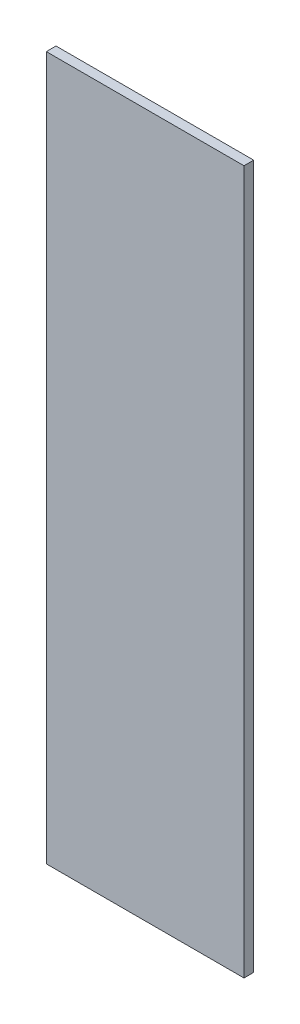
ISO-10303-21;
HEADER;
FILE_DESCRIPTION(('STEP AP214'),'2;1');
FILE_NAME('part.step','',(''),(''),'','','');
FILE_SCHEMA(('AUTOMOTIVE_DESIGN { 1 0 10303 214 1 1 1 1 }'));
ENDSEC;
DATA;
#1=APPLICATION_CONTEXT('core data for automotive mechanical design processes');
#2=APPLICATION_PROTOCOL_DEFINITION('international standard','automotive_design',2000,#1);
#3=PRODUCT_CONTEXT('',#1,'mechanical');
#4=PRODUCT('Part','Part','',(#3));
#5=PRODUCT_RELATED_PRODUCT_CATEGORY('part','',(#4));
#6=PRODUCT_DEFINITION_FORMATION('','',#4);
#7=PRODUCT_DEFINITION_CONTEXT('part definition',#1,'design');
#8=PRODUCT_DEFINITION('design','',#6,#7);
#9=PRODUCT_DEFINITION_SHAPE('','',#8);
#10=(LENGTH_UNIT() NAMED_UNIT(*) SI_UNIT(.MILLI.,.METRE.));
#11=(NAMED_UNIT(*) PLANE_ANGLE_UNIT() SI_UNIT($,.RADIAN.));
#12=(NAMED_UNIT(*) SI_UNIT($,.STERADIAN.) SOLID_ANGLE_UNIT());
#13=UNCERTAINTY_MEASURE_WITH_UNIT(LENGTH_MEASURE(1.E-05),#10,'distance_accuracy_value','');
#14=(GEOMETRIC_REPRESENTATION_CONTEXT(3) GLOBAL_UNCERTAINTY_ASSIGNED_CONTEXT((#13)) GLOBAL_UNIT_ASSIGNED_CONTEXT((#10,
#11,#12)) REPRESENTATION_CONTEXT('',''));
#15=CARTESIAN_POINT('',(0.,0.,0.));
#16=DIRECTION('',(0.,0.,1.));
#17=DIRECTION('',(1.,0.,0.));
#18=AXIS2_PLACEMENT_3D('',#15,#16,#17);
#19=CARTESIAN_POINT('',(-40.75,-145.,4.));
#20=DIRECTION('',(1.,0.,0.));
#21=DIRECTION('',(0.,1.,0.));
#22=AXIS2_PLACEMENT_3D('',#19,#20,#21);
#23=PLANE('',#22);
#24=DIRECTION('',(0.,-1.,0.));
#25=VECTOR('',#24,1.);
#26=CARTESIAN_POINT('',(-40.75,-145.,0.));
#27=LINE('',#26,#25);
#28=CARTESIAN_POINT('',(-40.75,145.,0.));
#29=VERTEX_POINT('',#28);
#30=CARTESIAN_POINT('',(-40.75,-145.,0.));
#31=VERTEX_POINT('',#30);
#32=EDGE_CURVE('E97',#29,#31,#27,.T.);
#33=ORIENTED_EDGE('',*,*,#32,.T.);
#34=DIRECTION('',(0.,0.,-1.));
#35=VECTOR('',#34,1.);
#36=CARTESIAN_POINT('',(-40.75,-145.,4.));
#37=LINE('',#36,#35);
#38=CARTESIAN_POINT('',(-40.75,-145.,4.));
#39=VERTEX_POINT('',#38);
#40=EDGE_CURVE('E11',#39,#31,#37,.T.);
#41=ORIENTED_EDGE('',*,*,#40,.F.);
#42=DIRECTION('',(0.,-1.,0.));
#43=VECTOR('',#42,1.);
#44=CARTESIAN_POINT('',(-40.75,-145.,4.));
#45=LINE('',#44,#43);
#46=CARTESIAN_POINT('',(-40.75,145.,4.));
#47=VERTEX_POINT('',#46);
#48=EDGE_CURVE('E85',#47,#39,#45,.T.);
#49=ORIENTED_EDGE('',*,*,#48,.F.);
#50=DIRECTION('',(0.,0.,-1.));
#51=VECTOR('',#50,1.);
#52=CARTESIAN_POINT('',(-40.75,145.,4.));
#53=LINE('',#52,#51);
#54=EDGE_CURVE('E93',#47,#29,#53,.T.);
#55=ORIENTED_EDGE('',*,*,#54,.T.);
#56=EDGE_LOOP('',(#33,#41,#49,#55));
#57=FACE_BOUND('',#56,.T.);
#58=ADVANCED_FACE('F34',(#57),#23,.F.);
#59=CARTESIAN_POINT('',(40.75,-145.,4.));
#60=DIRECTION('',(0.,1.,0.));
#61=DIRECTION('',(0.,0.,1.));
#62=AXIS2_PLACEMENT_3D('',#59,#60,#61);
#63=PLANE('',#62);
#64=DIRECTION('',(1.,0.,0.));
#65=VECTOR('',#64,1.);
#66=CARTESIAN_POINT('',(40.75,-145.,0.));
#67=LINE('',#66,#65);
#68=CARTESIAN_POINT('',(40.75,-145.,0.));
#69=VERTEX_POINT('',#68);
#70=EDGE_CURVE('E89',#31,#69,#67,.T.);
#71=ORIENTED_EDGE('',*,*,#70,.T.);
#72=DIRECTION('',(0.,0.,-1.));
#73=VECTOR('',#72,1.);
#74=CARTESIAN_POINT('',(40.75,-145.,4.));
#75=LINE('',#74,#73);
#76=CARTESIAN_POINT('',(40.75,-145.,4.));
#77=VERTEX_POINT('',#76);
#78=EDGE_CURVE('E42',#77,#69,#75,.T.);
#79=ORIENTED_EDGE('',*,*,#78,.F.);
#80=DIRECTION('',(1.,0.,0.));
#81=VECTOR('',#80,1.);
#82=CARTESIAN_POINT('',(40.75,-145.,4.));
#83=LINE('',#82,#81);
#84=EDGE_CURVE('E80',#39,#77,#83,.T.);
#85=ORIENTED_EDGE('',*,*,#84,.F.);
#86=ORIENTED_EDGE('',*,*,#40,.T.);
#87=EDGE_LOOP('',(#71,#79,#85,#86));
#88=FACE_BOUND('',#87,.T.);
#89=ADVANCED_FACE('F88',(#88),#63,.F.);
#90=CARTESIAN_POINT('',(40.75,-145.,4.));
#91=DIRECTION('',(-1.,0.,0.));
#92=DIRECTION('',(0.,-1.,0.));
#93=AXIS2_PLACEMENT_3D('',#90,#91,#92);
#94=PLANE('',#93);
#95=DIRECTION('',(0.,1.,0.));
#96=VECTOR('',#95,1.);
#97=CARTESIAN_POINT('',(40.75,-145.,0.));
#98=LINE('',#97,#96);
#99=CARTESIAN_POINT('',(40.75,145.,0.));
#100=VERTEX_POINT('',#99);
#101=EDGE_CURVE('E67',#69,#100,#98,.T.);
#102=ORIENTED_EDGE('',*,*,#101,.T.);
#103=DIRECTION('',(0.,0.,-1.));
#104=VECTOR('',#103,1.);
#105=CARTESIAN_POINT('',(40.75,145.,4.));
#106=LINE('',#105,#104);
#107=CARTESIAN_POINT('',(40.75,145.,4.));
#108=VERTEX_POINT('',#107);
#109=EDGE_CURVE('E90',#108,#100,#106,.T.);
#110=ORIENTED_EDGE('',*,*,#109,.F.);
#111=DIRECTION('',(0.,1.,0.));
#112=VECTOR('',#111,1.);
#113=CARTESIAN_POINT('',(40.75,-145.,4.));
#114=LINE('',#113,#112);
#115=EDGE_CURVE('E83',#77,#108,#114,.T.);
#116=ORIENTED_EDGE('',*,*,#115,.F.);
#117=ORIENTED_EDGE('',*,*,#78,.T.);
#118=EDGE_LOOP('',(#102,#110,#116,#117));
#119=FACE_BOUND('',#118,.T.);
#120=ADVANCED_FACE('F91',(#119),#94,.F.);
#121=CARTESIAN_POINT('',(40.75,145.,4.));
#122=DIRECTION('',(0.,-1.,0.));
#123=DIRECTION('',(1.,0.,0.));
#124=AXIS2_PLACEMENT_3D('',#121,#122,#123);
#125=PLANE('',#124);
#126=DIRECTION('',(-1.,0.,0.));
#127=VECTOR('',#126,1.);
#128=CARTESIAN_POINT('',(40.75,145.,0.));
#129=LINE('',#128,#127);
#130=EDGE_CURVE('E73',#100,#29,#129,.T.);
#131=ORIENTED_EDGE('',*,*,#130,.T.);
#132=ORIENTED_EDGE('',*,*,#54,.F.);
#133=DIRECTION('',(-1.,0.,0.));
#134=VECTOR('',#133,1.);
#135=CARTESIAN_POINT('',(40.75,145.,4.));
#136=LINE('',#135,#134);
#137=EDGE_CURVE('E50',#108,#47,#136,.T.);
#138=ORIENTED_EDGE('',*,*,#137,.F.);
#139=ORIENTED_EDGE('',*,*,#109,.T.);
#140=EDGE_LOOP('',(#131,#132,#138,#139));
#141=FACE_BOUND('',#140,.T.);
#142=ADVANCED_FACE('F104',(#141),#125,.F.);
#143=CARTESIAN_POINT('',(0.,0.,4.));
#144=DIRECTION('',(0.,0.,1.));
#145=DIRECTION('',(1.,0.,0.));
#146=AXIS2_PLACEMENT_3D('',#143,#144,#145);
#147=PLANE('',#146);
#148=ORIENTED_EDGE('',*,*,#48,.T.);
#149=ORIENTED_EDGE('',*,*,#84,.T.);
#150=ORIENTED_EDGE('',*,*,#115,.T.);
#151=ORIENTED_EDGE('',*,*,#137,.T.);
#152=EDGE_LOOP('',(#148,#149,#150,#151));
#153=FACE_BOUND('',#152,.T.);
#154=ADVANCED_FACE('F81',(#153),#147,.T.);
#155=CARTESIAN_POINT('',(0.,0.,0.));
#156=DIRECTION('',(0.,0.,1.));
#157=DIRECTION('',(1.,0.,0.));
#158=AXIS2_PLACEMENT_3D('',#155,#156,#157);
#159=PLANE('',#158);
#160=ORIENTED_EDGE('',*,*,#32,.F.);
#161=ORIENTED_EDGE('',*,*,#130,.F.);
#162=ORIENTED_EDGE('',*,*,#101,.F.);
#163=ORIENTED_EDGE('',*,*,#70,.F.);
#164=EDGE_LOOP('',(#160,#161,#162,#163));
#165=FACE_BOUND('',#164,.T.);
#166=ADVANCED_FACE('F107',(#165),#159,.F.);
#167=CLOSED_SHELL('',(#58,#89,#120,#142,#154,#166));
#168=MANIFOLD_SOLID_BREP('B2',#167);
#169=ADVANCED_BREP_SHAPE_REPRESENTATION('',(#18,#168),#14);
#170=SHAPE_DEFINITION_REPRESENTATION(#9,#169);
ENDSEC;
END-ISO-10303-21;
